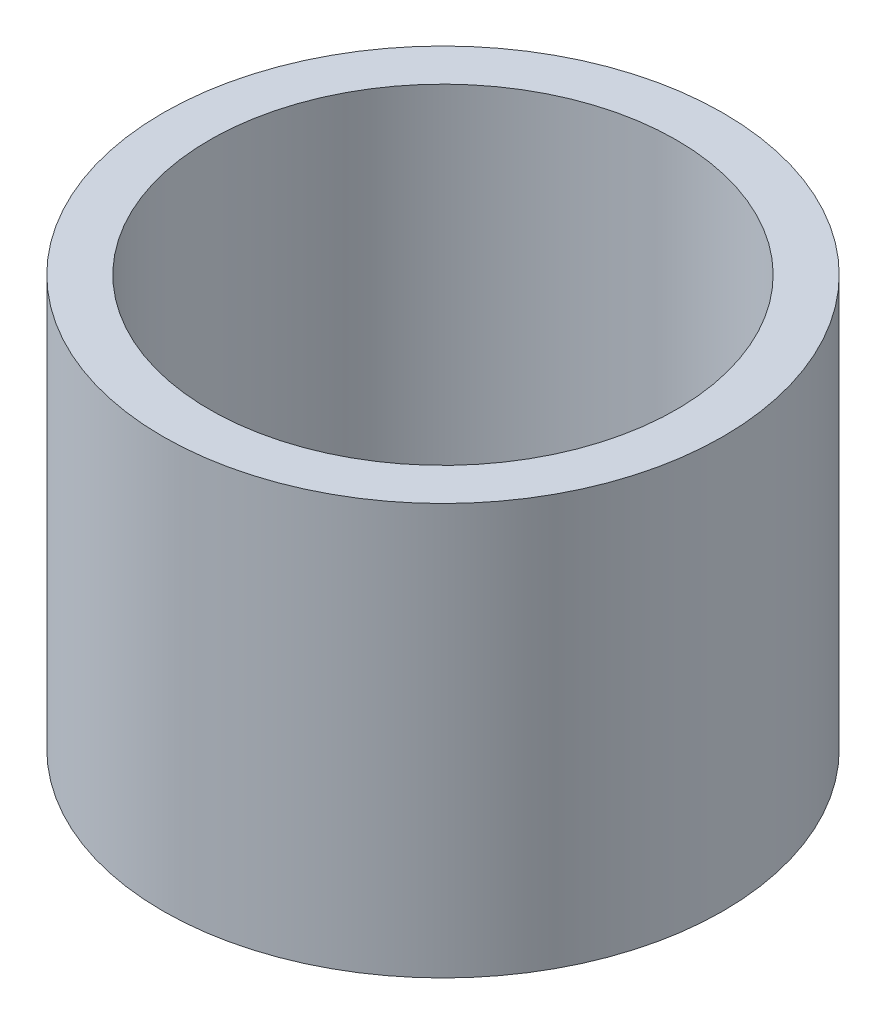
ISO-10303-21;
HEADER;
FILE_DESCRIPTION(('STEP AP214'),'2;1');
FILE_NAME('part.step','',(''),(''),'','','');
FILE_SCHEMA(('AUTOMOTIVE_DESIGN { 1 0 10303 214 1 1 1 1 }'));
ENDSEC;
DATA;
#1=APPLICATION_CONTEXT('core data for automotive mechanical design processes');
#2=APPLICATION_PROTOCOL_DEFINITION('international standard','automotive_design',2000,#1);
#3=PRODUCT_CONTEXT('',#1,'mechanical');
#4=PRODUCT('Part','Part','',(#3));
#5=PRODUCT_RELATED_PRODUCT_CATEGORY('part','',(#4));
#6=PRODUCT_DEFINITION_FORMATION('','',#4);
#7=PRODUCT_DEFINITION_CONTEXT('part definition',#1,'design');
#8=PRODUCT_DEFINITION('design','',#6,#7);
#9=PRODUCT_DEFINITION_SHAPE('','',#8);
#10=(LENGTH_UNIT() NAMED_UNIT(*) SI_UNIT(.MILLI.,.METRE.));
#11=(NAMED_UNIT(*) PLANE_ANGLE_UNIT() SI_UNIT($,.RADIAN.));
#12=(NAMED_UNIT(*) SI_UNIT($,.STERADIAN.) SOLID_ANGLE_UNIT());
#13=UNCERTAINTY_MEASURE_WITH_UNIT(LENGTH_MEASURE(1.E-05),#10,'distance_accuracy_value','');
#14=(GEOMETRIC_REPRESENTATION_CONTEXT(3) GLOBAL_UNCERTAINTY_ASSIGNED_CONTEXT((#13)) GLOBAL_UNIT_ASSIGNED_CONTEXT((#10,
#11,#12)) REPRESENTATION_CONTEXT('',''));
#15=CARTESIAN_POINT('',(0.,0.,0.));
#16=DIRECTION('',(0.,0.,1.));
#17=DIRECTION('',(1.,0.,0.));
#18=AXIS2_PLACEMENT_3D('',#15,#16,#17);
#19=CARTESIAN_POINT('',(0.,-1.2,0.));
#20=DIRECTION('',(0.,-1.,0.));
#21=DIRECTION('',(0.,0.,-1.));
#22=AXIS2_PLACEMENT_3D('',#19,#20,#21);
#23=PLANE('',#22);
#24=CARTESIAN_POINT('',(0.,-1.2,0.));
#25=DIRECTION('',(0.,-1.,0.));
#26=DIRECTION('',(0.,0.,-1.));
#27=AXIS2_PLACEMENT_3D('',#24,#25,#26);
#28=CIRCLE('',#27,12.5);
#29=CARTESIAN_POINT('',(0.,-1.2,-12.5));
#30=VERTEX_POINT('',#29);
#31=EDGE_CURVE('E49',#30,#30,#28,.T.);
#32=ORIENTED_EDGE('',*,*,#31,.T.);
#33=EDGE_LOOP('',(#32));
#34=FACE_BOUND('',#33,.T.);
#35=CARTESIAN_POINT('',(0.,-1.2,0.));
#36=DIRECTION('',(0.,-1.,0.));
#37=DIRECTION('',(0.,0.,-1.));
#38=AXIS2_PLACEMENT_3D('',#35,#36,#37);
#39=CIRCLE('',#38,15.);
#40=CARTESIAN_POINT('',(0.,-1.2,-15.));
#41=VERTEX_POINT('',#40);
#42=EDGE_CURVE('E42',#41,#41,#39,.T.);
#43=ORIENTED_EDGE('',*,*,#42,.F.);
#44=EDGE_LOOP('',(#43));
#45=FACE_BOUND('',#44,.T.);
#46=ADVANCED_FACE('F38',(#34,#45),#23,.F.);
#47=CARTESIAN_POINT('',(0.,-23.2,0.));
#48=DIRECTION('',(0.,-1.,0.));
#49=DIRECTION('',(0.,0.,-1.));
#50=AXIS2_PLACEMENT_3D('',#47,#48,#49);
#51=PLANE('',#50);
#52=CARTESIAN_POINT('',(0.,-23.2,0.));
#53=DIRECTION('',(0.,-1.,0.));
#54=DIRECTION('',(0.,0.,-1.));
#55=AXIS2_PLACEMENT_3D('',#52,#53,#54);
#56=CIRCLE('',#55,12.5);
#57=CARTESIAN_POINT('',(0.,-23.2,-12.5));
#58=VERTEX_POINT('',#57);
#59=EDGE_CURVE('E53',#58,#58,#56,.T.);
#60=ORIENTED_EDGE('',*,*,#59,.F.);
#61=EDGE_LOOP('',(#60));
#62=FACE_BOUND('',#61,.T.);
#63=CARTESIAN_POINT('',(0.,-23.2,0.));
#64=DIRECTION('',(0.,-1.,0.));
#65=DIRECTION('',(0.,0.,-1.));
#66=AXIS2_PLACEMENT_3D('',#63,#64,#65);
#67=CIRCLE('',#66,15.);
#68=CARTESIAN_POINT('',(0.,-23.2,-15.));
#69=VERTEX_POINT('',#68);
#70=EDGE_CURVE('E12',#69,#69,#67,.T.);
#71=ORIENTED_EDGE('',*,*,#70,.T.);
#72=EDGE_LOOP('',(#71));
#73=FACE_BOUND('',#72,.T.);
#74=ADVANCED_FACE('F60',(#62,#73),#51,.T.);
#75=CARTESIAN_POINT('',(0.,-23.2,0.));
#76=DIRECTION('',(0.,1.,0.));
#77=DIRECTION('',(0.,0.,1.));
#78=AXIS2_PLACEMENT_3D('',#75,#76,#77);
#79=CYLINDRICAL_SURFACE('',#78,15.);
#80=ORIENTED_EDGE('',*,*,#70,.F.);
#81=EDGE_LOOP('',(#80));
#82=FACE_BOUND('',#81,.T.);
#83=ORIENTED_EDGE('',*,*,#42,.T.);
#84=EDGE_LOOP('',(#83));
#85=FACE_BOUND('',#84,.T.);
#86=ADVANCED_FACE('F40',(#82,#85),#79,.T.);
#87=CARTESIAN_POINT('',(0.,18.8,0.));
#88=DIRECTION('',(0.,-1.,0.));
#89=DIRECTION('',(0.,0.,-1.));
#90=AXIS2_PLACEMENT_3D('',#87,#88,#89);
#91=CYLINDRICAL_SURFACE('',#90,12.5);
#92=CARTESIAN_POINT('',(0.,-23.2,-12.5));
#93=CARTESIAN_POINT('',(0.,-22.9708333333333,-12.5));
#94=CARTESIAN_POINT('',(0.,-22.7416666666667,-12.5));
#95=CARTESIAN_POINT('',(0.,-22.2833333333333,-12.5));
#96=CARTESIAN_POINT('',(0.,-22.0541666666667,-12.5));
#97=CARTESIAN_POINT('',(0.,-21.5958333333333,-12.5));
#98=CARTESIAN_POINT('',(0.,-21.3666666666667,-12.5));
#99=CARTESIAN_POINT('',(0.,-20.9083333333333,-12.5));
#100=CARTESIAN_POINT('',(0.,-20.6791666666667,-12.5));
#101=CARTESIAN_POINT('',(0.,-20.2208333333333,-12.5));
#102=CARTESIAN_POINT('',(0.,-19.9916666666667,-12.5));
#103=CARTESIAN_POINT('',(0.,-19.5333333333333,-12.5));
#104=CARTESIAN_POINT('',(0.,-19.3041666666667,-12.5));
#105=CARTESIAN_POINT('',(0.,-18.8458333333333,-12.5));
#106=CARTESIAN_POINT('',(0.,-18.6166666666667,-12.5));
#107=CARTESIAN_POINT('',(0.,-18.1583333333333,-12.5));
#108=CARTESIAN_POINT('',(0.,-17.9291666666667,-12.5));
#109=CARTESIAN_POINT('',(0.,-17.4708333333333,-12.5));
#110=CARTESIAN_POINT('',(0.,-17.2416666666667,-12.5));
#111=CARTESIAN_POINT('',(0.,-16.7833333333333,-12.5));
#112=CARTESIAN_POINT('',(0.,-16.5541666666667,-12.5));
#113=CARTESIAN_POINT('',(0.,-16.0958333333333,-12.5));
#114=CARTESIAN_POINT('',(0.,-15.8666666666667,-12.5));
#115=CARTESIAN_POINT('',(0.,-15.4083333333333,-12.5));
#116=CARTESIAN_POINT('',(0.,-15.1791666666667,-12.5));
#117=CARTESIAN_POINT('',(0.,-14.7208333333333,-12.5));
#118=CARTESIAN_POINT('',(0.,-14.4916666666667,-12.5));
#119=CARTESIAN_POINT('',(0.,-14.0333333333333,-12.5));
#120=CARTESIAN_POINT('',(0.,-13.8041666666667,-12.5));
#121=CARTESIAN_POINT('',(0.,-13.3458333333333,-12.5));
#122=CARTESIAN_POINT('',(0.,-13.1166666666667,-12.5));
#123=CARTESIAN_POINT('',(0.,-12.6583333333333,-12.5));
#124=CARTESIAN_POINT('',(0.,-12.4291666666667,-12.5));
#125=CARTESIAN_POINT('',(0.,-11.9708333333333,-12.5));
#126=CARTESIAN_POINT('',(0.,-11.7416666666667,-12.5));
#127=CARTESIAN_POINT('',(0.,-11.2833333333333,-12.5));
#128=CARTESIAN_POINT('',(0.,-11.0541666666667,-12.5));
#129=CARTESIAN_POINT('',(0.,-10.5958333333333,-12.5));
#130=CARTESIAN_POINT('',(0.,-10.3666666666667,-12.5));
#131=CARTESIAN_POINT('',(0.,-9.90833333333333,-12.5));
#132=CARTESIAN_POINT('',(0.,-9.67916666666666,-12.5));
#133=CARTESIAN_POINT('',(0.,-9.22083333333333,-12.5));
#134=CARTESIAN_POINT('',(0.,-8.99166666666666,-12.5));
#135=CARTESIAN_POINT('',(0.,-8.53333333333333,-12.5));
#136=CARTESIAN_POINT('',(0.,-8.30416666666667,-12.5));
#137=CARTESIAN_POINT('',(0.,-7.84583333333333,-12.5));
#138=CARTESIAN_POINT('',(0.,-7.61666666666666,-12.5));
#139=CARTESIAN_POINT('',(0.,-7.15833333333333,-12.5));
#140=CARTESIAN_POINT('',(0.,-6.92916666666666,-12.5));
#141=CARTESIAN_POINT('',(0.,-6.47083333333333,-12.5));
#142=CARTESIAN_POINT('',(0.,-6.24166666666666,-12.5));
#143=CARTESIAN_POINT('',(0.,-5.78333333333333,-12.5));
#144=CARTESIAN_POINT('',(0.,-5.55416666666666,-12.5));
#145=CARTESIAN_POINT('',(0.,-5.09583333333333,-12.5));
#146=CARTESIAN_POINT('',(0.,-4.86666666666666,-12.5));
#147=CARTESIAN_POINT('',(0.,-4.40833333333333,-12.5));
#148=CARTESIAN_POINT('',(0.,-4.17916666666666,-12.5));
#149=CARTESIAN_POINT('',(0.,-3.72083333333333,-12.5));
#150=CARTESIAN_POINT('',(0.,-3.49166666666666,-12.5));
#151=CARTESIAN_POINT('',(0.,-3.03333333333333,-12.5));
#152=CARTESIAN_POINT('',(0.,-2.80416666666666,-12.5));
#153=CARTESIAN_POINT('',(0.,-2.34583333333333,-12.5));
#154=CARTESIAN_POINT('',(0.,-2.11666666666666,-12.5));
#155=CARTESIAN_POINT('',(0.,-1.65833333333333,-12.5));
#156=CARTESIAN_POINT('',(0.,-1.42916666666666,-12.5));
#157=CARTESIAN_POINT('',(0.,-1.2,-12.5));
#158=B_SPLINE_CURVE_WITH_KNOTS('',3,(#92,#93,#94,#95,#96,#97,#98,#99,#100,#101,#102,#103,#104,
#105,#106,#107,#108,#109,#110,#111,#112,#113,#114,#115,#116,#117,#118,#119,#120,#121,#122,#123,
#124,#125,#126,#127,#128,#129,#130,#131,#132,#133,#134,#135,#136,#137,#138,#139,#140,#141,#142,
#143,#144,#145,#146,#147,#148,#149,#150,#151,#152,#153,#154,#155,#156,#157),.UNSPECIFIED.,.F.,
.F.,(4,2,2,2,2,2,2,2,2,2,2,2,2,2,2,2,2,2,2,2,2,2,2,2,2,2,2,2,2,2,2,2,4),(0.,0.687500000000001,
1.375,2.0625,2.75,3.4375,4.125,4.8125,5.50000000000001,6.1875,6.875,7.5625,8.25,8.9375,9.625,
10.3125,11.,11.6875,12.375,13.0625,13.75,14.4375,15.125,15.8125,16.5,17.1875,17.875,18.5625,
19.25,19.9375,20.625,21.3125,22.),.UNSPECIFIED.);
#159=EDGE_CURVE('BSEAM57',#58,#30,#158,.T.);
#160=ORIENTED_EDGE('',*,*,#59,.T.);
#161=ORIENTED_EDGE('',*,*,#31,.F.);
#162=ORIENTED_EDGE('',*,*,#159,.T.);
#163=ORIENTED_EDGE('',*,*,#159,.F.);
#164=EDGE_LOOP('',(#160,#162,#161,#163));
#165=FACE_BOUND('',#164,.T.);
#166=ADVANCED_FACE('F57',(#165),#91,.F.);
#167=CLOSED_SHELL('',(#46,#74,#86,#166));
#168=MANIFOLD_SOLID_BREP('B2',#167);
#169=ADVANCED_BREP_SHAPE_REPRESENTATION('',(#18,#168),#14);
#170=SHAPE_DEFINITION_REPRESENTATION(#9,#169);
ENDSEC;
END-ISO-10303-21;
